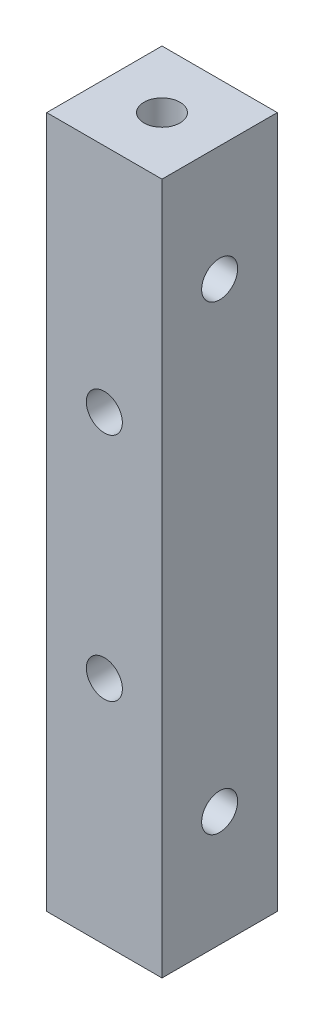
ISO-10303-21;
HEADER;
FILE_DESCRIPTION(('STEP AP214'),'2;1');
FILE_NAME('part.step','',(''),(''),'','','');
FILE_SCHEMA(('AUTOMOTIVE_DESIGN { 1 0 10303 214 1 1 1 1 }'));
ENDSEC;
DATA;
#1=APPLICATION_CONTEXT('core data for automotive mechanical design processes');
#2=APPLICATION_PROTOCOL_DEFINITION('international standard','automotive_design',2000,#1);
#3=PRODUCT_CONTEXT('',#1,'mechanical');
#4=PRODUCT('Part','Part','',(#3));
#5=PRODUCT_RELATED_PRODUCT_CATEGORY('part','',(#4));
#6=PRODUCT_DEFINITION_FORMATION('','',#4);
#7=PRODUCT_DEFINITION_CONTEXT('part definition',#1,'design');
#8=PRODUCT_DEFINITION('design','',#6,#7);
#9=PRODUCT_DEFINITION_SHAPE('','',#8);
#10=(LENGTH_UNIT() NAMED_UNIT(*) SI_UNIT(.MILLI.,.METRE.));
#11=(NAMED_UNIT(*) PLANE_ANGLE_UNIT() SI_UNIT($,.RADIAN.));
#12=(NAMED_UNIT(*) SI_UNIT($,.STERADIAN.) SOLID_ANGLE_UNIT());
#13=UNCERTAINTY_MEASURE_WITH_UNIT(LENGTH_MEASURE(1.E-05),#10,'distance_accuracy_value','');
#14=(GEOMETRIC_REPRESENTATION_CONTEXT(3) GLOBAL_UNCERTAINTY_ASSIGNED_CONTEXT((#13)) GLOBAL_UNIT_ASSIGNED_CONTEXT((#10,
#11,#12)) REPRESENTATION_CONTEXT('',''));
#15=CARTESIAN_POINT('',(0.,0.,0.));
#16=DIRECTION('',(0.,0.,1.));
#17=DIRECTION('',(1.,0.,0.));
#18=AXIS2_PLACEMENT_3D('',#15,#16,#17);
#19=CARTESIAN_POINT('',(0.,8.,4.));
#20=DIRECTION('',(0.,0.,1.));
#21=DIRECTION('',(1.,0.,0.));
#22=AXIS2_PLACEMENT_3D('',#19,#20,#21);
#23=CYLINDRICAL_SURFACE('',#22,1.25);
#24=CARTESIAN_POINT('',(0.,8.,4.));
#25=DIRECTION('',(0.,0.,1.));
#26=DIRECTION('',(1.,0.,0.));
#27=AXIS2_PLACEMENT_3D('',#24,#25,#26);
#28=CIRCLE('',#27,1.25);
#29=CARTESIAN_POINT('',(1.25,8.,4.));
#30=VERTEX_POINT('',#29);
#31=EDGE_CURVE('E165',#30,#30,#28,.T.);
#32=ORIENTED_EDGE('',*,*,#31,.T.);
#33=EDGE_LOOP('',(#32));
#34=FACE_BOUND('',#33,.T.);
#35=CARTESIAN_POINT('',(0.,8.,0.));
#36=DIRECTION('',(0.,0.707106781186547,0.707106781186547));
#37=DIRECTION('',(0.,-0.707106781186547,0.707106781186547));
#38=AXIS2_PLACEMENT_3D('',#35,#36,#37);
#39=ELLIPSE('',#38,1.76776695296636,1.24999999999999);
#40=CARTESIAN_POINT('',(1.25,8.,0.));
#41=VERTEX_POINT('',#40);
#42=CARTESIAN_POINT('',(-1.24999999999999,8.,0.));
#43=VERTEX_POINT('',#42);
#44=EDGE_CURVE('E56',#41,#43,#39,.F.);
#45=ORIENTED_EDGE('',*,*,#44,.T.);
#46=CARTESIAN_POINT('',(0.,8.,0.));
#47=DIRECTION('',(0.,-0.707106781186547,0.707106781186547));
#48=DIRECTION('',(0.,0.707106781186547,0.707106781186547));
#49=AXIS2_PLACEMENT_3D('',#46,#47,#48);
#50=ELLIPSE('',#49,1.76776695296636,1.24999999999999);
#51=EDGE_CURVE('E180',#43,#41,#50,.F.);
#52=ORIENTED_EDGE('',*,*,#51,.T.);
#53=EDGE_LOOP('',(#45,#52));
#54=FACE_BOUND('',#53,.T.);
#55=ADVANCED_FACE('F42',(#34,#54),#23,.F.);
#56=CARTESIAN_POINT('',(0.,-8.,4.));
#57=DIRECTION('',(0.,0.,1.));
#58=DIRECTION('',(1.,0.,0.));
#59=AXIS2_PLACEMENT_3D('',#56,#57,#58);
#60=CYLINDRICAL_SURFACE('',#59,1.25);
#61=CARTESIAN_POINT('',(0.,-8.,4.));
#62=DIRECTION('',(0.,0.,1.));
#63=DIRECTION('',(1.,0.,0.));
#64=AXIS2_PLACEMENT_3D('',#61,#62,#63);
#65=CIRCLE('',#64,1.25);
#66=CARTESIAN_POINT('',(1.25,-8.,4.));
#67=VERTEX_POINT('',#66);
#68=EDGE_CURVE('E159',#67,#67,#65,.T.);
#69=ORIENTED_EDGE('',*,*,#68,.T.);
#70=EDGE_LOOP('',(#69));
#71=FACE_BOUND('',#70,.T.);
#72=CARTESIAN_POINT('',(0.,-8.,0.));
#73=DIRECTION('',(0.,0.707106781186547,0.707106781186547));
#74=DIRECTION('',(0.,-0.707106781186547,0.707106781186547));
#75=AXIS2_PLACEMENT_3D('',#72,#73,#74);
#76=ELLIPSE('',#75,1.76776695296636,1.24999999999999);
#77=CARTESIAN_POINT('',(1.25,-8.,0.));
#78=VERTEX_POINT('',#77);
#79=CARTESIAN_POINT('',(-1.24999999999999,-8.,0.));
#80=VERTEX_POINT('',#79);
#81=EDGE_CURVE('E63',#78,#80,#76,.F.);
#82=ORIENTED_EDGE('',*,*,#81,.T.);
#83=CARTESIAN_POINT('',(0.,-8.,0.));
#84=DIRECTION('',(0.,-0.707106781186547,0.707106781186547));
#85=DIRECTION('',(0.,0.707106781186547,0.707106781186547));
#86=AXIS2_PLACEMENT_3D('',#83,#84,#85);
#87=ELLIPSE('',#86,1.76776695296636,1.24999999999999);
#88=EDGE_CURVE('E189',#80,#78,#87,.F.);
#89=ORIENTED_EDGE('',*,*,#88,.T.);
#90=EDGE_LOOP('',(#82,#89));
#91=FACE_BOUND('',#90,.T.);
#92=ADVANCED_FACE('F251',(#71,#91),#60,.F.);
#93=CARTESIAN_POINT('',(4.,16.,0.));
#94=DIRECTION('',(1.,0.,0.));
#95=DIRECTION('',(0.,0.,-1.));
#96=AXIS2_PLACEMENT_3D('',#93,#94,#95);
#97=CYLINDRICAL_SURFACE('',#96,1.24999999999999);
#98=CARTESIAN_POINT('',(4.,16.,0.));
#99=DIRECTION('',(1.,0.,0.));
#100=DIRECTION('',(0.,0.,-1.));
#101=AXIS2_PLACEMENT_3D('',#98,#99,#100);
#102=CIRCLE('',#101,1.24999999999999);
#103=CARTESIAN_POINT('',(4.,16.,-1.24999999999999));
#104=VERTEX_POINT('',#103);
#105=EDGE_CURVE('E177',#104,#104,#102,.T.);
#106=ORIENTED_EDGE('',*,*,#105,.T.);
#107=EDGE_LOOP('',(#106));
#108=FACE_BOUND('',#107,.T.);
#109=CARTESIAN_POINT('',(0.,16.,0.));
#110=DIRECTION('',(0.707106781186547,0.707106781186547,0.));
#111=DIRECTION('',(0.707106781186547,-0.707106781186547,0.));
#112=AXIS2_PLACEMENT_3D('',#109,#110,#111);
#113=ELLIPSE('',#112,1.76776695296636,1.24999999999999);
#114=CARTESIAN_POINT('',(0.,16.,-1.24999999999999));
#115=VERTEX_POINT('',#114);
#116=CARTESIAN_POINT('',(0.,16.,1.24999999999999));
#117=VERTEX_POINT('',#116);
#118=EDGE_CURVE('E207',#115,#117,#113,.F.);
#119=ORIENTED_EDGE('',*,*,#118,.T.);
#120=CARTESIAN_POINT('',(0.,16.,0.));
#121=DIRECTION('',(0.707106781186547,-0.707106781186547,0.));
#122=DIRECTION('',(0.707106781186547,0.707106781186547,0.));
#123=AXIS2_PLACEMENT_3D('',#120,#121,#122);
#124=ELLIPSE('',#123,1.76776695296636,1.24999999999999);
#125=EDGE_CURVE('E198',#117,#115,#124,.F.);
#126=ORIENTED_EDGE('',*,*,#125,.T.);
#127=EDGE_LOOP('',(#119,#126));
#128=FACE_BOUND('',#127,.T.);
#129=ADVANCED_FACE('F258',(#108,#128),#97,.F.);
#130=CARTESIAN_POINT('',(4.,-16.,0.));
#131=DIRECTION('',(1.,0.,0.));
#132=DIRECTION('',(0.,0.,-1.));
#133=AXIS2_PLACEMENT_3D('',#130,#131,#132);
#134=CYLINDRICAL_SURFACE('',#133,1.24999999999999);
#135=CARTESIAN_POINT('',(4.,-16.,0.));
#136=DIRECTION('',(1.,0.,0.));
#137=DIRECTION('',(0.,0.,-1.));
#138=AXIS2_PLACEMENT_3D('',#135,#136,#137);
#139=CIRCLE('',#138,1.24999999999999);
#140=CARTESIAN_POINT('',(4.,-16.,-1.24999999999999));
#141=VERTEX_POINT('',#140);
#142=EDGE_CURVE('E171',#141,#141,#139,.T.);
#143=ORIENTED_EDGE('',*,*,#142,.T.);
#144=EDGE_LOOP('',(#143));
#145=FACE_BOUND('',#144,.T.);
#146=CARTESIAN_POINT('',(0.,-16.,0.));
#147=DIRECTION('',(0.707106781186547,0.707106781186547,0.));
#148=DIRECTION('',(0.707106781186547,-0.707106781186547,0.));
#149=AXIS2_PLACEMENT_3D('',#146,#147,#148);
#150=ELLIPSE('',#149,1.76776695296636,1.24999999999999);
#151=CARTESIAN_POINT('',(0.,-16.,-1.24999999999999));
#152=VERTEX_POINT('',#151);
#153=CARTESIAN_POINT('',(0.,-16.,1.24999999999999));
#154=VERTEX_POINT('',#153);
#155=EDGE_CURVE('E115',#152,#154,#150,.F.);
#156=ORIENTED_EDGE('',*,*,#155,.T.);
#157=CARTESIAN_POINT('',(0.,-16.,0.));
#158=DIRECTION('',(0.707106781186547,-0.707106781186547,0.));
#159=DIRECTION('',(0.707106781186547,0.707106781186547,0.));
#160=AXIS2_PLACEMENT_3D('',#157,#158,#159);
#161=ELLIPSE('',#160,1.76776695296636,1.24999999999999);
#162=EDGE_CURVE('E11',#154,#152,#161,.F.);
#163=ORIENTED_EDGE('',*,*,#162,.T.);
#164=EDGE_LOOP('',(#156,#163));
#165=FACE_BOUND('',#164,.T.);
#166=ADVANCED_FACE('F123',(#145,#165),#134,.F.);
#167=CARTESIAN_POINT('',(4.,24.,4.));
#168=DIRECTION('',(-1.,0.,0.));
#169=DIRECTION('',(0.,0.,1.));
#170=AXIS2_PLACEMENT_3D('',#167,#168,#169);
#171=PLANE('',#170);
#172=ORIENTED_EDGE('',*,*,#105,.F.);
#173=EDGE_LOOP('',(#172));
#174=FACE_BOUND('',#173,.T.);
#175=ORIENTED_EDGE('',*,*,#142,.F.);
#176=EDGE_LOOP('',(#175));
#177=FACE_BOUND('',#176,.T.);
#178=DIRECTION('',(0.,0.,-1.));
#179=VECTOR('',#178,1.);
#180=CARTESIAN_POINT('',(4.,-24.,4.));
#181=LINE('',#180,#179);
#182=CARTESIAN_POINT('',(4.,-24.,4.));
#183=VERTEX_POINT('',#182);
#184=CARTESIAN_POINT('',(4.,-24.,-4.));
#185=VERTEX_POINT('',#184);
#186=EDGE_CURVE('E146',#183,#185,#181,.T.);
#187=ORIENTED_EDGE('',*,*,#186,.T.);
#188=DIRECTION('',(0.,-1.,0.));
#189=VECTOR('',#188,1.);
#190=CARTESIAN_POINT('',(4.,24.,-4.));
#191=LINE('',#190,#189);
#192=CARTESIAN_POINT('',(4.,24.,-4.));
#193=VERTEX_POINT('',#192);
#194=EDGE_CURVE('E121',#193,#185,#191,.T.);
#195=ORIENTED_EDGE('',*,*,#194,.F.);
#196=DIRECTION('',(0.,0.,-1.));
#197=VECTOR('',#196,1.);
#198=CARTESIAN_POINT('',(4.,24.,4.));
#199=LINE('',#198,#197);
#200=CARTESIAN_POINT('',(4.,24.,4.));
#201=VERTEX_POINT('',#200);
#202=EDGE_CURVE('E141',#201,#193,#199,.T.);
#203=ORIENTED_EDGE('',*,*,#202,.F.);
#204=DIRECTION('',(0.,-1.,0.));
#205=VECTOR('',#204,1.);
#206=CARTESIAN_POINT('',(4.,24.,4.));
#207=LINE('',#206,#205);
#208=EDGE_CURVE('E135',#201,#183,#207,.T.);
#209=ORIENTED_EDGE('',*,*,#208,.T.);
#210=EDGE_LOOP('',(#187,#195,#203,#209));
#211=FACE_BOUND('',#210,.T.);
#212=ADVANCED_FACE('F44',(#174,#177,#211),#171,.F.);
#213=CARTESIAN_POINT('',(-4.,24.,-4.));
#214=DIRECTION('',(0.,0.,1.));
#215=DIRECTION('',(1.,0.,0.));
#216=AXIS2_PLACEMENT_3D('',#213,#214,#215);
#217=PLANE('',#216);
#218=CARTESIAN_POINT('',(0.,8.,-4.));
#219=DIRECTION('',(0.,0.,1.));
#220=DIRECTION('',(1.,0.,0.));
#221=AXIS2_PLACEMENT_3D('',#218,#219,#220);
#222=CIRCLE('',#221,1.25);
#223=CARTESIAN_POINT('',(1.25,8.,-4.));
#224=VERTEX_POINT('',#223);
#225=EDGE_CURVE('E162',#224,#224,#222,.T.);
#226=ORIENTED_EDGE('',*,*,#225,.T.);
#227=EDGE_LOOP('',(#226));
#228=FACE_BOUND('',#227,.T.);
#229=CARTESIAN_POINT('',(0.,-8.,-4.));
#230=DIRECTION('',(0.,0.,1.));
#231=DIRECTION('',(1.,0.,0.));
#232=AXIS2_PLACEMENT_3D('',#229,#230,#231);
#233=CIRCLE('',#232,1.25);
#234=CARTESIAN_POINT('',(1.25,-8.,-4.));
#235=VERTEX_POINT('',#234);
#236=EDGE_CURVE('E149',#235,#235,#233,.T.);
#237=ORIENTED_EDGE('',*,*,#236,.T.);
#238=EDGE_LOOP('',(#237));
#239=FACE_BOUND('',#238,.T.);
#240=DIRECTION('',(-1.,0.,0.));
#241=VECTOR('',#240,1.);
#242=CARTESIAN_POINT('',(-4.,-24.,-4.));
#243=LINE('',#242,#241);
#244=CARTESIAN_POINT('',(-4.,-24.,-4.));
#245=VERTEX_POINT('',#244);
#246=EDGE_CURVE('E144',#185,#245,#243,.T.);
#247=ORIENTED_EDGE('',*,*,#246,.T.);
#248=DIRECTION('',(0.,-1.,0.));
#249=VECTOR('',#248,1.);
#250=CARTESIAN_POINT('',(-4.,24.,-4.));
#251=LINE('',#250,#249);
#252=CARTESIAN_POINT('',(-4.,24.,-4.));
#253=VERTEX_POINT('',#252);
#254=EDGE_CURVE('E129',#253,#245,#251,.T.);
#255=ORIENTED_EDGE('',*,*,#254,.F.);
#256=DIRECTION('',(-1.,0.,0.));
#257=VECTOR('',#256,1.);
#258=CARTESIAN_POINT('',(-4.,24.,-4.));
#259=LINE('',#258,#257);
#260=EDGE_CURVE('E153',#193,#253,#259,.T.);
#261=ORIENTED_EDGE('',*,*,#260,.F.);
#262=ORIENTED_EDGE('',*,*,#194,.T.);
#263=EDGE_LOOP('',(#247,#255,#261,#262));
#264=FACE_BOUND('',#263,.T.);
#265=ADVANCED_FACE('F239',(#228,#239,#264),#217,.F.);
#266=CARTESIAN_POINT('',(-4.,24.,4.));
#267=DIRECTION('',(1.,0.,0.));
#268=DIRECTION('',(0.,0.,-1.));
#269=AXIS2_PLACEMENT_3D('',#266,#267,#268);
#270=PLANE('',#269);
#271=CARTESIAN_POINT('',(-4.,16.,0.));
#272=DIRECTION('',(1.,0.,0.));
#273=DIRECTION('',(0.,0.,-1.));
#274=AXIS2_PLACEMENT_3D('',#271,#272,#273);
#275=CIRCLE('',#274,1.25);
#276=CARTESIAN_POINT('',(-4.,16.,-1.25));
#277=VERTEX_POINT('',#276);
#278=EDGE_CURVE('E174',#277,#277,#275,.T.);
#279=ORIENTED_EDGE('',*,*,#278,.T.);
#280=EDGE_LOOP('',(#279));
#281=FACE_BOUND('',#280,.T.);
#282=CARTESIAN_POINT('',(-4.,-16.,0.));
#283=DIRECTION('',(1.,0.,0.));
#284=DIRECTION('',(0.,0.,-1.));
#285=AXIS2_PLACEMENT_3D('',#282,#283,#284);
#286=CIRCLE('',#285,1.25);
#287=CARTESIAN_POINT('',(-4.,-16.,-1.25));
#288=VERTEX_POINT('',#287);
#289=EDGE_CURVE('E168',#288,#288,#286,.T.);
#290=ORIENTED_EDGE('',*,*,#289,.T.);
#291=EDGE_LOOP('',(#290));
#292=FACE_BOUND('',#291,.T.);
#293=DIRECTION('',(0.,0.,1.));
#294=VECTOR('',#293,1.);
#295=CARTESIAN_POINT('',(-4.,-24.,4.));
#296=LINE('',#295,#294);
#297=CARTESIAN_POINT('',(-4.,-24.,4.));
#298=VERTEX_POINT('',#297);
#299=EDGE_CURVE('E142',#245,#298,#296,.T.);
#300=ORIENTED_EDGE('',*,*,#299,.T.);
#301=DIRECTION('',(0.,-1.,0.));
#302=VECTOR('',#301,1.);
#303=CARTESIAN_POINT('',(-4.,24.,4.));
#304=LINE('',#303,#302);
#305=CARTESIAN_POINT('',(-4.,24.,4.));
#306=VERTEX_POINT('',#305);
#307=EDGE_CURVE('E132',#306,#298,#304,.T.);
#308=ORIENTED_EDGE('',*,*,#307,.F.);
#309=DIRECTION('',(0.,0.,1.));
#310=VECTOR('',#309,1.);
#311=CARTESIAN_POINT('',(-4.,24.,4.));
#312=LINE('',#311,#310);
#313=EDGE_CURVE('E151',#253,#306,#312,.T.);
#314=ORIENTED_EDGE('',*,*,#313,.F.);
#315=ORIENTED_EDGE('',*,*,#254,.T.);
#316=EDGE_LOOP('',(#300,#308,#314,#315));
#317=FACE_BOUND('',#316,.T.);
#318=ADVANCED_FACE('F236',(#281,#292,#317),#270,.F.);
#319=CARTESIAN_POINT('',(-4.,24.,4.));
#320=DIRECTION('',(0.,0.,-1.));
#321=DIRECTION('',(-1.,0.,0.));
#322=AXIS2_PLACEMENT_3D('',#319,#320,#321);
#323=PLANE('',#322);
#324=ORIENTED_EDGE('',*,*,#31,.F.);
#325=EDGE_LOOP('',(#324));
#326=FACE_BOUND('',#325,.T.);
#327=ORIENTED_EDGE('',*,*,#68,.F.);
#328=EDGE_LOOP('',(#327));
#329=FACE_BOUND('',#328,.T.);
#330=DIRECTION('',(1.,0.,0.));
#331=VECTOR('',#330,1.);
#332=CARTESIAN_POINT('',(-4.,-24.,4.));
#333=LINE('',#332,#331);
#334=EDGE_CURVE('E139',#298,#183,#333,.T.);
#335=ORIENTED_EDGE('',*,*,#334,.T.);
#336=ORIENTED_EDGE('',*,*,#208,.F.);
#337=DIRECTION('',(1.,0.,0.));
#338=VECTOR('',#337,1.);
#339=CARTESIAN_POINT('',(-4.,24.,4.));
#340=LINE('',#339,#338);
#341=EDGE_CURVE('E138',#306,#201,#340,.T.);
#342=ORIENTED_EDGE('',*,*,#341,.F.);
#343=ORIENTED_EDGE('',*,*,#307,.T.);
#344=EDGE_LOOP('',(#335,#336,#342,#343));
#345=FACE_BOUND('',#344,.T.);
#346=ADVANCED_FACE('F232',(#326,#329,#345),#323,.F.);
#347=CARTESIAN_POINT('',(0.,24.,0.));
#348=DIRECTION('',(0.,-1.,0.));
#349=DIRECTION('',(0.,0.,-1.));
#350=AXIS2_PLACEMENT_3D('',#347,#348,#349);
#351=PLANE('',#350);
#352=CARTESIAN_POINT('',(0.,24.,0.));
#353=DIRECTION('',(0.,-1.,0.));
#354=DIRECTION('',(0.,0.,-1.));
#355=AXIS2_PLACEMENT_3D('',#352,#353,#354);
#356=CIRCLE('',#355,1.24999999999999);
#357=CARTESIAN_POINT('',(0.,24.,-1.24999999999999));
#358=VERTEX_POINT('',#357);
#359=EDGE_CURVE('E209',#358,#358,#356,.T.);
#360=ORIENTED_EDGE('',*,*,#359,.T.);
#361=EDGE_LOOP('',(#360));
#362=FACE_BOUND('',#361,.T.);
#363=ORIENTED_EDGE('',*,*,#202,.T.);
#364=ORIENTED_EDGE('',*,*,#260,.T.);
#365=ORIENTED_EDGE('',*,*,#313,.T.);
#366=ORIENTED_EDGE('',*,*,#341,.T.);
#367=EDGE_LOOP('',(#363,#364,#365,#366));
#368=FACE_BOUND('',#367,.T.);
#369=ADVANCED_FACE('F221',(#362,#368),#351,.F.);
#370=CARTESIAN_POINT('',(0.,-24.,0.));
#371=DIRECTION('',(0.,-1.,0.));
#372=DIRECTION('',(0.,0.,-1.));
#373=AXIS2_PLACEMENT_3D('',#370,#371,#372);
#374=PLANE('',#373);
#375=CARTESIAN_POINT('',(0.,-24.,0.));
#376=DIRECTION('',(0.,-1.,0.));
#377=DIRECTION('',(0.,0.,-1.));
#378=AXIS2_PLACEMENT_3D('',#375,#376,#377);
#379=CIRCLE('',#378,1.24999999999999);
#380=CARTESIAN_POINT('',(0.,-24.,-1.24999999999999));
#381=VERTEX_POINT('',#380);
#382=EDGE_CURVE('E212',#381,#381,#379,.T.);
#383=ORIENTED_EDGE('',*,*,#382,.F.);
#384=EDGE_LOOP('',(#383));
#385=FACE_BOUND('',#384,.T.);
#386=ORIENTED_EDGE('',*,*,#186,.F.);
#387=ORIENTED_EDGE('',*,*,#334,.F.);
#388=ORIENTED_EDGE('',*,*,#299,.F.);
#389=ORIENTED_EDGE('',*,*,#246,.F.);
#390=EDGE_LOOP('',(#386,#387,#388,#389));
#391=FACE_BOUND('',#390,.T.);
#392=ADVANCED_FACE('F217',(#385,#391),#374,.T.);
#393=CARTESIAN_POINT('',(0.,-8.,0.));
#394=DIRECTION('',(0.,0.707106781186547,0.707106781186547));
#395=DIRECTION('',(0.,-0.707106781186547,0.707106781186547));
#396=AXIS2_PLACEMENT_3D('',#393,#394,#395);
#397=ELLIPSE('',#396,1.76776695296636,1.24999999999999);
#398=EDGE_CURVE('E194',#78,#80,#397,.T.);
#399=ORIENTED_EDGE('',*,*,#398,.T.);
#400=CARTESIAN_POINT('',(0.,-8.,0.));
#401=DIRECTION('',(0.,-0.707106781186547,0.707106781186547));
#402=DIRECTION('',(0.,0.707106781186547,0.707106781186547));
#403=AXIS2_PLACEMENT_3D('',#400,#401,#402);
#404=ELLIPSE('',#403,1.76776695296636,1.24999999999999);
#405=EDGE_CURVE('E191',#80,#78,#404,.T.);
#406=ORIENTED_EDGE('',*,*,#405,.T.);
#407=EDGE_LOOP('',(#399,#406));
#408=FACE_BOUND('',#407,.T.);
#409=ORIENTED_EDGE('',*,*,#236,.F.);
#410=EDGE_LOOP('',(#409));
#411=FACE_BOUND('',#410,.T.);
#412=ADVANCED_FACE('F220',(#408,#411),#60,.F.);
#413=CARTESIAN_POINT('',(0.,8.,0.));
#414=DIRECTION('',(0.,0.707106781186547,0.707106781186547));
#415=DIRECTION('',(0.,-0.707106781186547,0.707106781186547));
#416=AXIS2_PLACEMENT_3D('',#413,#414,#415);
#417=ELLIPSE('',#416,1.76776695296636,1.24999999999999);
#418=EDGE_CURVE('E185',#41,#43,#417,.T.);
#419=ORIENTED_EDGE('',*,*,#418,.T.);
#420=CARTESIAN_POINT('',(0.,8.,0.));
#421=DIRECTION('',(0.,-0.707106781186547,0.707106781186547));
#422=DIRECTION('',(0.,0.707106781186547,0.707106781186547));
#423=AXIS2_PLACEMENT_3D('',#420,#421,#422);
#424=ELLIPSE('',#423,1.76776695296636,1.24999999999999);
#425=EDGE_CURVE('E182',#43,#41,#424,.T.);
#426=ORIENTED_EDGE('',*,*,#425,.T.);
#427=EDGE_LOOP('',(#419,#426));
#428=FACE_BOUND('',#427,.T.);
#429=ORIENTED_EDGE('',*,*,#225,.F.);
#430=EDGE_LOOP('',(#429));
#431=FACE_BOUND('',#430,.T.);
#432=ADVANCED_FACE('F254',(#428,#431),#23,.F.);
#433=CARTESIAN_POINT('',(0.,-16.,0.));
#434=DIRECTION('',(0.707106781186547,0.707106781186547,0.));
#435=DIRECTION('',(0.707106781186547,-0.707106781186547,0.));
#436=AXIS2_PLACEMENT_3D('',#433,#434,#435);
#437=ELLIPSE('',#436,1.76776695296636,1.24999999999999);
#438=EDGE_CURVE('E109',#152,#154,#437,.T.);
#439=ORIENTED_EDGE('',*,*,#438,.T.);
#440=CARTESIAN_POINT('',(0.,-16.,0.));
#441=DIRECTION('',(0.707106781186547,-0.707106781186547,0.));
#442=DIRECTION('',(0.707106781186547,0.707106781186547,0.));
#443=AXIS2_PLACEMENT_3D('',#440,#441,#442);
#444=ELLIPSE('',#443,1.76776695296636,1.24999999999999);
#445=EDGE_CURVE('E50',#154,#152,#444,.T.);
#446=ORIENTED_EDGE('',*,*,#445,.T.);
#447=EDGE_LOOP('',(#439,#446));
#448=FACE_BOUND('',#447,.T.);
#449=ORIENTED_EDGE('',*,*,#289,.F.);
#450=EDGE_LOOP('',(#449));
#451=FACE_BOUND('',#450,.T.);
#452=ADVANCED_FACE('F124',(#448,#451),#134,.F.);
#453=CARTESIAN_POINT('',(0.,16.,0.));
#454=DIRECTION('',(0.707106781186547,0.707106781186547,0.));
#455=DIRECTION('',(0.707106781186547,-0.707106781186547,0.));
#456=AXIS2_PLACEMENT_3D('',#453,#454,#455);
#457=ELLIPSE('',#456,1.76776695296636,1.24999999999999);
#458=EDGE_CURVE('E204',#115,#117,#457,.T.);
#459=ORIENTED_EDGE('',*,*,#458,.T.);
#460=CARTESIAN_POINT('',(0.,16.,0.));
#461=DIRECTION('',(0.707106781186547,-0.707106781186547,0.));
#462=DIRECTION('',(0.707106781186547,0.707106781186547,0.));
#463=AXIS2_PLACEMENT_3D('',#460,#461,#462);
#464=ELLIPSE('',#463,1.76776695296636,1.24999999999999);
#465=EDGE_CURVE('E201',#117,#115,#464,.T.);
#466=ORIENTED_EDGE('',*,*,#465,.T.);
#467=EDGE_LOOP('',(#459,#466));
#468=FACE_BOUND('',#467,.T.);
#469=ORIENTED_EDGE('',*,*,#278,.F.);
#470=EDGE_LOOP('',(#469));
#471=FACE_BOUND('',#470,.T.);
#472=ADVANCED_FACE('F267',(#468,#471),#97,.F.);
#473=CARTESIAN_POINT('',(0.,-24.,0.));
#474=DIRECTION('',(0.,-1.,0.));
#475=DIRECTION('',(0.,0.,-1.));
#476=AXIS2_PLACEMENT_3D('',#473,#474,#475);
#477=CYLINDRICAL_SURFACE('',#476,1.24999999999999);
#478=ORIENTED_EDGE('',*,*,#382,.T.);
#479=EDGE_LOOP('',(#478));
#480=FACE_BOUND('',#479,.T.);
#481=ORIENTED_EDGE('',*,*,#155,.F.);
#482=ORIENTED_EDGE('',*,*,#445,.F.);
#483=EDGE_LOOP('',(#481,#482));
#484=FACE_BOUND('',#483,.T.);
#485=ADVANCED_FACE('F119',(#480,#484),#477,.F.);
#486=ORIENTED_EDGE('',*,*,#118,.F.);
#487=ORIENTED_EDGE('',*,*,#465,.F.);
#488=EDGE_LOOP('',(#486,#487));
#489=FACE_BOUND('',#488,.T.);
#490=ORIENTED_EDGE('',*,*,#418,.F.);
#491=ORIENTED_EDGE('',*,*,#51,.F.);
#492=EDGE_LOOP('',(#490,#491));
#493=FACE_BOUND('',#492,.T.);
#494=ADVANCED_FACE('F298',(#489,#493),#477,.F.);
#495=ORIENTED_EDGE('',*,*,#359,.F.);
#496=EDGE_LOOP('',(#495));
#497=FACE_BOUND('',#496,.T.);
#498=ORIENTED_EDGE('',*,*,#458,.F.);
#499=ORIENTED_EDGE('',*,*,#125,.F.);
#500=EDGE_LOOP('',(#498,#499));
#501=FACE_BOUND('',#500,.T.);
#502=ADVANCED_FACE('F302',(#497,#501),#477,.F.);
#503=ORIENTED_EDGE('',*,*,#438,.F.);
#504=ORIENTED_EDGE('',*,*,#162,.F.);
#505=EDGE_LOOP('',(#503,#504));
#506=FACE_BOUND('',#505,.T.);
#507=ORIENTED_EDGE('',*,*,#81,.F.);
#508=ORIENTED_EDGE('',*,*,#405,.F.);
#509=EDGE_LOOP('',(#507,#508));
#510=FACE_BOUND('',#509,.T.);
#511=ADVANCED_FACE('F111',(#506,#510),#477,.F.);
#512=ORIENTED_EDGE('',*,*,#398,.F.);
#513=ORIENTED_EDGE('',*,*,#88,.F.);
#514=EDGE_LOOP('',(#512,#513));
#515=FACE_BOUND('',#514,.T.);
#516=ORIENTED_EDGE('',*,*,#44,.F.);
#517=ORIENTED_EDGE('',*,*,#425,.F.);
#518=EDGE_LOOP('',(#516,#517));
#519=FACE_BOUND('',#518,.T.);
#520=ADVANCED_FACE('F313',(#515,#519),#477,.F.);
#521=CLOSED_SHELL('',(#55,#92,#129,#166,#212,#265,#318,#346,#369,#392,#412,#432,#452,#472,#485,
#494,#502,#511,#520));
#522=MANIFOLD_SOLID_BREP('B2',#521);
#523=ADVANCED_BREP_SHAPE_REPRESENTATION('',(#18,#522),#14);
#524=SHAPE_DEFINITION_REPRESENTATION(#9,#523);
ENDSEC;
END-ISO-10303-21;
